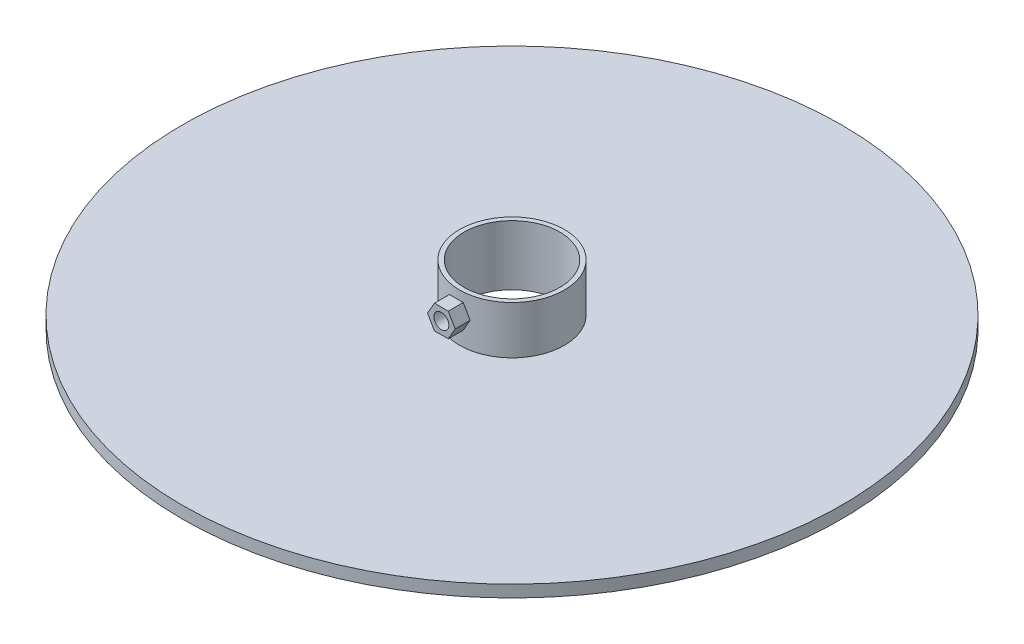
ISO-10303-21;
HEADER;
FILE_DESCRIPTION(('STEP AP214'),'2;1');
FILE_NAME('part.step','',(''),(''),'','','');
FILE_SCHEMA(('AUTOMOTIVE_DESIGN { 1 0 10303 214 1 1 1 1 }'));
ENDSEC;
DATA;
#1=APPLICATION_CONTEXT('core data for automotive mechanical design processes');
#2=APPLICATION_PROTOCOL_DEFINITION('international standard','automotive_design',2000,#1);
#3=PRODUCT_CONTEXT('',#1,'mechanical');
#4=PRODUCT('Part','Part','',(#3));
#5=PRODUCT_RELATED_PRODUCT_CATEGORY('part','',(#4));
#6=PRODUCT_DEFINITION_FORMATION('','',#4);
#7=PRODUCT_DEFINITION_CONTEXT('part definition',#1,'design');
#8=PRODUCT_DEFINITION('design','',#6,#7);
#9=PRODUCT_DEFINITION_SHAPE('','',#8);
#10=(LENGTH_UNIT() NAMED_UNIT(*) SI_UNIT(.MILLI.,.METRE.));
#11=(NAMED_UNIT(*) PLANE_ANGLE_UNIT() SI_UNIT($,.RADIAN.));
#12=(NAMED_UNIT(*) SI_UNIT($,.STERADIAN.) SOLID_ANGLE_UNIT());
#13=UNCERTAINTY_MEASURE_WITH_UNIT(LENGTH_MEASURE(1.E-05),#10,'distance_accuracy_value','');
#14=(GEOMETRIC_REPRESENTATION_CONTEXT(3) GLOBAL_UNCERTAINTY_ASSIGNED_CONTEXT((#13)) GLOBAL_UNIT_ASSIGNED_CONTEXT((#10,
#11,#12)) REPRESENTATION_CONTEXT('',''));
#15=CARTESIAN_POINT('',(0.,0.,0.));
#16=DIRECTION('',(0.,0.,1.));
#17=DIRECTION('',(1.,0.,0.));
#18=AXIS2_PLACEMENT_3D('',#15,#16,#17);
#19=CARTESIAN_POINT('',(0.,0.,22.5000000000001));
#20=DIRECTION('',(0.,0.,1.));
#21=DIRECTION('',(1.,0.,0.));
#22=AXIS2_PLACEMENT_3D('',#19,#20,#21);
#23=PLANE('',#22);
#24=DIRECTION('',(0.499999999999995,0.866025403784441,0.));
#25=VECTOR('',#24,1.);
#26=CARTESIAN_POINT('',(1.22724765148557,-620.502918688389,22.5000000000001));
#27=LINE('',#26,#25);
#28=CARTESIAN_POINT('',(1.22724765148557,-620.502918688389,22.5000000000001));
#29=VERTEX_POINT('',#28);
#30=CARTESIAN_POINT('',(3.53664872824411,-616.502918688388,22.5000000000001));
#31=VERTEX_POINT('',#30);
#32=EDGE_CURVE('E141',#29,#31,#27,.T.);
#33=ORIENTED_EDGE('',*,*,#32,.T.);
#34=DIRECTION('',(-0.500000000000005,0.866025403784436,0.));
#35=VECTOR('',#34,1.);
#36=CARTESIAN_POINT('',(3.53664872824411,-616.502918688388,22.5000000000001));
#37=LINE('',#36,#35);
#38=CARTESIAN_POINT('',(1.22724765148564,-612.502918688389,22.5000000000001));
#39=VERTEX_POINT('',#38);
#40=EDGE_CURVE('E99',#31,#39,#37,.T.);
#41=ORIENTED_EDGE('',*,*,#40,.T.);
#42=DIRECTION('',(-1.,0.,0.));
#43=VECTOR('',#42,1.);
#44=CARTESIAN_POINT('',(1.22724765148564,-612.502918688389,22.5000000000001));
#45=LINE('',#44,#43);
#46=CARTESIAN_POINT('',(-3.39155450203123,-612.502918688389,22.5000000000001));
#47=VERTEX_POINT('',#46);
#48=EDGE_CURVE('E112',#39,#47,#45,.T.);
#49=ORIENTED_EDGE('',*,*,#48,.T.);
#50=DIRECTION('',(-0.500000000000003,-0.866025403784437,0.));
#51=VECTOR('',#50,1.);
#52=CARTESIAN_POINT('',(-3.39155450203123,-612.502918688389,22.5000000000001));
#53=LINE('',#52,#51);
#54=CARTESIAN_POINT('',(-5.7009555787897,-616.502918688388,22.5000000000001));
#55=VERTEX_POINT('',#54);
#56=EDGE_CURVE('E106',#47,#55,#53,.T.);
#57=ORIENTED_EDGE('',*,*,#56,.T.);
#58=DIRECTION('',(0.499999999999997,-0.86602540378444,0.));
#59=VECTOR('',#58,1.);
#60=CARTESIAN_POINT('',(-5.7009555787897,-616.502918688388,22.5000000000001));
#61=LINE('',#60,#59);
#62=CARTESIAN_POINT('',(-3.39155450203115,-620.502918688389,22.5000000000001));
#63=VERTEX_POINT('',#62);
#64=EDGE_CURVE('E110',#55,#63,#61,.T.);
#65=ORIENTED_EDGE('',*,*,#64,.T.);
#66=DIRECTION('',(1.,0.,0.));
#67=VECTOR('',#66,1.);
#68=CARTESIAN_POINT('',(-3.39155450203115,-620.502918688389,22.5000000000001));
#69=LINE('',#68,#67);
#70=EDGE_CURVE('E62',#63,#29,#69,.T.);
#71=ORIENTED_EDGE('',*,*,#70,.T.);
#72=EDGE_LOOP('',(#33,#41,#49,#57,#65,#71));
#73=FACE_BOUND('',#72,.T.);
#74=CARTESIAN_POINT('',(-1.08215342527274,-616.502918688388,22.5000000000001));
#75=DIRECTION('',(0.,0.,1.));
#76=DIRECTION('',(1.,0.,0.));
#77=AXIS2_PLACEMENT_3D('',#74,#75,#76);
#78=CIRCLE('',#77,2.5);
#79=CARTESIAN_POINT('',(1.41784657472726,-616.502918688388,22.5000000000001));
#80=VERTEX_POINT('',#79);
#81=EDGE_CURVE('E134',#80,#80,#78,.T.);
#82=ORIENTED_EDGE('',*,*,#81,.F.);
#83=EDGE_LOOP('',(#82));
#84=FACE_BOUND('',#83,.T.);
#85=ADVANCED_FACE('F45',(#73,#84),#23,.T.);
#86=CARTESIAN_POINT('',(0.,0.,17.5000000000001));
#87=DIRECTION('',(0.,0.,1.));
#88=DIRECTION('',(1.,0.,0.));
#89=AXIS2_PLACEMENT_3D('',#86,#87,#88);
#90=PLANE('',#89);
#91=DIRECTION('',(0.499999999999995,0.866025403784441,0.));
#92=VECTOR('',#91,1.);
#93=CARTESIAN_POINT('',(1.22724765148557,-620.502918688389,17.5000000000001));
#94=LINE('',#93,#92);
#95=CARTESIAN_POINT('',(1.22724765148557,-620.502918688389,17.5000000000001));
#96=VERTEX_POINT('',#95);
#97=CARTESIAN_POINT('',(3.53664872824411,-616.502918688388,17.5000000000001));
#98=VERTEX_POINT('',#97);
#99=EDGE_CURVE('E130',#96,#98,#94,.T.);
#100=ORIENTED_EDGE('',*,*,#99,.F.);
#101=DIRECTION('',(1.,0.,0.));
#102=VECTOR('',#101,1.);
#103=CARTESIAN_POINT('',(-3.39155450203115,-620.502918688389,17.5000000000001));
#104=LINE('',#103,#102);
#105=CARTESIAN_POINT('',(-3.39155450203115,-620.502918688389,17.5000000000001));
#106=VERTEX_POINT('',#105);
#107=EDGE_CURVE('E91',#106,#96,#104,.T.);
#108=ORIENTED_EDGE('',*,*,#107,.F.);
#109=DIRECTION('',(0.499999999999997,-0.86602540378444,0.));
#110=VECTOR('',#109,1.);
#111=CARTESIAN_POINT('',(-5.7009555787897,-616.502918688388,17.5000000000001));
#112=LINE('',#111,#110);
#113=CARTESIAN_POINT('',(-5.7009555787897,-616.502918688388,17.5000000000001));
#114=VERTEX_POINT('',#113);
#115=EDGE_CURVE('E85',#114,#106,#112,.T.);
#116=ORIENTED_EDGE('',*,*,#115,.F.);
#117=DIRECTION('',(-0.500000000000003,-0.866025403784437,0.));
#118=VECTOR('',#117,1.);
#119=CARTESIAN_POINT('',(-3.39155450203123,-612.502918688389,17.5000000000001));
#120=LINE('',#119,#118);
#121=CARTESIAN_POINT('',(-3.39155450203123,-612.502918688389,17.5000000000001));
#122=VERTEX_POINT('',#121);
#123=EDGE_CURVE('E120',#122,#114,#120,.T.);
#124=ORIENTED_EDGE('',*,*,#123,.F.);
#125=DIRECTION('',(-1.,0.,0.));
#126=VECTOR('',#125,1.);
#127=CARTESIAN_POINT('',(1.22724765148564,-612.502918688389,17.5000000000001));
#128=LINE('',#127,#126);
#129=CARTESIAN_POINT('',(1.22724765148564,-612.502918688389,17.5000000000001));
#130=VERTEX_POINT('',#129);
#131=EDGE_CURVE('E136',#130,#122,#128,.T.);
#132=ORIENTED_EDGE('',*,*,#131,.F.);
#133=DIRECTION('',(-0.500000000000005,0.866025403784436,0.));
#134=VECTOR('',#133,1.);
#135=CARTESIAN_POINT('',(3.53664872824411,-616.502918688388,17.5000000000001));
#136=LINE('',#135,#134);
#137=EDGE_CURVE('E133',#98,#130,#136,.T.);
#138=ORIENTED_EDGE('',*,*,#137,.F.);
#139=EDGE_LOOP('',(#100,#108,#116,#124,#132,#138));
#140=FACE_BOUND('',#139,.T.);
#141=CARTESIAN_POINT('',(-1.08215342527274,-616.502918688388,17.5000000000001));
#142=DIRECTION('',(0.,0.,1.));
#143=DIRECTION('',(1.,0.,0.));
#144=AXIS2_PLACEMENT_3D('',#141,#142,#143);
#145=CIRCLE('',#144,2.5);
#146=CARTESIAN_POINT('',(1.41784657472726,-616.502918688388,17.5000000000001));
#147=VERTEX_POINT('',#146);
#148=EDGE_CURVE('E234',#147,#147,#145,.T.);
#149=ORIENTED_EDGE('',*,*,#148,.T.);
#150=EDGE_LOOP('',(#149));
#151=FACE_BOUND('',#150,.T.);
#152=ADVANCED_FACE('F150',(#140,#151),#90,.F.);
#153=CARTESIAN_POINT('',(1.22724765148557,-620.502918688389,22.5000000000001));
#154=DIRECTION('',(-0.866025403784441,0.499999999999996,0.));
#155=DIRECTION('',(-0.499999999999996,-0.866025403784441,0.));
#156=AXIS2_PLACEMENT_3D('',#153,#154,#155);
#157=PLANE('',#156);
#158=ORIENTED_EDGE('',*,*,#99,.T.);
#159=DIRECTION('',(0.,0.,-1.));
#160=VECTOR('',#159,1.);
#161=CARTESIAN_POINT('',(3.53664872824411,-616.502918688388,22.5000000000001));
#162=LINE('',#161,#160);
#163=EDGE_CURVE('E12',#31,#98,#162,.T.);
#164=ORIENTED_EDGE('',*,*,#163,.F.);
#165=ORIENTED_EDGE('',*,*,#32,.F.);
#166=DIRECTION('',(0.,0.,-1.));
#167=VECTOR('',#166,1.);
#168=CARTESIAN_POINT('',(1.22724765148557,-620.502918688389,22.5000000000001));
#169=LINE('',#168,#167);
#170=EDGE_CURVE('E126',#29,#96,#169,.T.);
#171=ORIENTED_EDGE('',*,*,#170,.T.);
#172=EDGE_LOOP('',(#158,#164,#165,#171));
#173=FACE_BOUND('',#172,.T.);
#174=ADVANCED_FACE('F47',(#173),#157,.F.);
#175=CARTESIAN_POINT('',(3.53664872824411,-616.502918688388,22.5000000000001));
#176=DIRECTION('',(-0.866025403784436,-0.500000000000005,0.));
#177=DIRECTION('',(0.500000000000005,-0.866025403784436,0.));
#178=AXIS2_PLACEMENT_3D('',#175,#176,#177);
#179=PLANE('',#178);
#180=ORIENTED_EDGE('',*,*,#137,.T.);
#181=DIRECTION('',(0.,0.,-1.));
#182=VECTOR('',#181,1.);
#183=CARTESIAN_POINT('',(1.22724765148564,-612.502918688389,22.5000000000001));
#184=LINE('',#183,#182);
#185=EDGE_CURVE('E54',#39,#130,#184,.T.);
#186=ORIENTED_EDGE('',*,*,#185,.F.);
#187=ORIENTED_EDGE('',*,*,#40,.F.);
#188=ORIENTED_EDGE('',*,*,#163,.T.);
#189=EDGE_LOOP('',(#180,#186,#187,#188));
#190=FACE_BOUND('',#189,.T.);
#191=ADVANCED_FACE('F175',(#190),#179,.F.);
#192=CARTESIAN_POINT('',(1.22724765148564,-612.502918688389,22.5000000000001));
#193=DIRECTION('',(0.,-1.,0.));
#194=DIRECTION('',(0.,0.,-1.));
#195=AXIS2_PLACEMENT_3D('',#192,#193,#194);
#196=PLANE('',#195);
#197=ORIENTED_EDGE('',*,*,#131,.T.);
#198=DIRECTION('',(0.,0.,-1.));
#199=VECTOR('',#198,1.);
#200=CARTESIAN_POINT('',(-3.39155450203123,-612.502918688389,22.5000000000001));
#201=LINE('',#200,#199);
#202=EDGE_CURVE('E121',#47,#122,#201,.T.);
#203=ORIENTED_EDGE('',*,*,#202,.F.);
#204=ORIENTED_EDGE('',*,*,#48,.F.);
#205=ORIENTED_EDGE('',*,*,#185,.T.);
#206=EDGE_LOOP('',(#197,#203,#204,#205));
#207=FACE_BOUND('',#206,.T.);
#208=ADVANCED_FACE('F147',(#207),#196,.F.);
#209=CARTESIAN_POINT('',(-3.39155450203123,-612.502918688389,22.5000000000001));
#210=DIRECTION('',(0.866025403784437,-0.500000000000003,0.));
#211=DIRECTION('',(0.500000000000003,0.866025403784437,0.));
#212=AXIS2_PLACEMENT_3D('',#209,#210,#211);
#213=PLANE('',#212);
#214=ORIENTED_EDGE('',*,*,#123,.T.);
#215=DIRECTION('',(0.,0.,-1.));
#216=VECTOR('',#215,1.);
#217=CARTESIAN_POINT('',(-5.7009555787897,-616.502918688388,22.5000000000001));
#218=LINE('',#217,#216);
#219=EDGE_CURVE('E117',#55,#114,#218,.T.);
#220=ORIENTED_EDGE('',*,*,#219,.F.);
#221=ORIENTED_EDGE('',*,*,#56,.F.);
#222=ORIENTED_EDGE('',*,*,#202,.T.);
#223=EDGE_LOOP('',(#214,#220,#221,#222));
#224=FACE_BOUND('',#223,.T.);
#225=ADVANCED_FACE('F118',(#224),#213,.F.);
#226=CARTESIAN_POINT('',(-5.7009555787897,-616.502918688388,22.5000000000001));
#227=DIRECTION('',(0.866025403784441,0.499999999999997,0.));
#228=DIRECTION('',(-0.499999999999997,0.866025403784441,0.));
#229=AXIS2_PLACEMENT_3D('',#226,#227,#228);
#230=PLANE('',#229);
#231=ORIENTED_EDGE('',*,*,#115,.T.);
#232=DIRECTION('',(0.,0.,-1.));
#233=VECTOR('',#232,1.);
#234=CARTESIAN_POINT('',(-3.39155450203115,-620.502918688389,22.5000000000001));
#235=LINE('',#234,#233);
#236=EDGE_CURVE('E122',#63,#106,#235,.T.);
#237=ORIENTED_EDGE('',*,*,#236,.F.);
#238=ORIENTED_EDGE('',*,*,#64,.F.);
#239=ORIENTED_EDGE('',*,*,#219,.T.);
#240=EDGE_LOOP('',(#231,#237,#238,#239));
#241=FACE_BOUND('',#240,.T.);
#242=ADVANCED_FACE('F124',(#241),#230,.F.);
#243=CARTESIAN_POINT('',(-3.39155450203115,-620.502918688389,22.5000000000001));
#244=DIRECTION('',(0.,1.,0.));
#245=DIRECTION('',(0.,0.,1.));
#246=AXIS2_PLACEMENT_3D('',#243,#244,#245);
#247=PLANE('',#246);
#248=ORIENTED_EDGE('',*,*,#107,.T.);
#249=ORIENTED_EDGE('',*,*,#170,.F.);
#250=ORIENTED_EDGE('',*,*,#70,.F.);
#251=ORIENTED_EDGE('',*,*,#236,.T.);
#252=EDGE_LOOP('',(#248,#249,#250,#251));
#253=FACE_BOUND('',#252,.T.);
#254=ADVANCED_FACE('F155',(#253),#247,.F.);
#255=CARTESIAN_POINT('',(-1.08215342527274,-616.502918688388,22.5000000000001));
#256=DIRECTION('',(0.,0.,-1.));
#257=DIRECTION('',(-1.,0.,0.));
#258=AXIS2_PLACEMENT_3D('',#255,#256,#257);
#259=CYLINDRICAL_SURFACE('',#258,2.5);
#260=ORIENTED_EDGE('',*,*,#81,.T.);
#261=EDGE_LOOP('',(#260));
#262=FACE_BOUND('',#261,.T.);
#263=ORIENTED_EDGE('',*,*,#148,.F.);
#264=EDGE_LOOP('',(#263));
#265=FACE_BOUND('',#264,.T.);
#266=ADVANCED_FACE('F157',(#262,#265),#259,.F.);
#267=CLOSED_SHELL('',(#85,#152,#174,#191,#208,#225,#242,#254,#266));
#268=MANIFOLD_SOLID_BREP('B2',#267);
#269=CARTESIAN_POINT('',(0.,-625.502918688388,-110.));
#270=DIRECTION('',(0.,-1.,0.));
#271=DIRECTION('',(0.,0.,-1.));
#272=AXIS2_PLACEMENT_3D('',#269,#270,#271);
#273=PLANE('',#272);
#274=CARTESIAN_POINT('',(0.,-625.502918688388,0.));
#275=DIRECTION('',(0.,1.,0.));
#276=DIRECTION('',(0.,0.,1.));
#277=AXIS2_PLACEMENT_3D('',#274,#275,#276);
#278=CIRCLE('',#277,17.5000000000001);
#279=CARTESIAN_POINT('',(0.,-625.502918688388,17.5000000000001));
#280=VERTEX_POINT('',#279);
#281=EDGE_CURVE('E275',#280,#280,#278,.T.);
#282=ORIENTED_EDGE('',*,*,#281,.F.);
#283=EDGE_LOOP('',(#282));
#284=FACE_BOUND('',#283,.T.);
#285=CARTESIAN_POINT('',(0.,-625.502918688388,0.));
#286=DIRECTION('',(0.,1.,0.));
#287=DIRECTION('',(0.,0.,1.));
#288=AXIS2_PLACEMENT_3D('',#285,#286,#287);
#289=CIRCLE('',#288,110.);
#290=CARTESIAN_POINT('',(0.,-625.502918688388,110.));
#291=VERTEX_POINT('',#290);
#292=EDGE_CURVE('E43',#291,#291,#289,.T.);
#293=ORIENTED_EDGE('',*,*,#292,.T.);
#294=EDGE_LOOP('',(#293));
#295=FACE_BOUND('',#294,.T.);
#296=ADVANCED_FACE('F242',(#284,#295),#273,.F.);
#297=CARTESIAN_POINT('',(0.,0.,0.));
#298=DIRECTION('',(0.,1.,0.));
#299=DIRECTION('',(0.,0.,1.));
#300=AXIS2_PLACEMENT_3D('',#297,#298,#299);
#301=CYLINDRICAL_SURFACE('',#300,110.);
#302=ORIENTED_EDGE('',*,*,#292,.F.);
#303=EDGE_LOOP('',(#302));
#304=FACE_BOUND('',#303,.T.);
#305=CARTESIAN_POINT('',(0.,-629.502918688388,0.));
#306=DIRECTION('',(0.,1.,0.));
#307=DIRECTION('',(0.,0.,1.));
#308=AXIS2_PLACEMENT_3D('',#305,#306,#307);
#309=CIRCLE('',#308,110.);
#310=CARTESIAN_POINT('',(0.,-629.502918688388,110.));
#311=VERTEX_POINT('',#310);
#312=EDGE_CURVE('E255',#311,#311,#309,.T.);
#313=ORIENTED_EDGE('',*,*,#312,.T.);
#314=EDGE_LOOP('',(#313));
#315=FACE_BOUND('',#314,.T.);
#316=ADVANCED_FACE('F301',(#304,#315),#301,.T.);
#317=CARTESIAN_POINT('',(0.,-629.502918688388,-16.0000000000001));
#318=DIRECTION('',(0.,1.,0.));
#319=DIRECTION('',(0.,0.,1.));
#320=AXIS2_PLACEMENT_3D('',#317,#318,#319);
#321=PLANE('',#320);
#322=ORIENTED_EDGE('',*,*,#312,.F.);
#323=EDGE_LOOP('',(#322));
#324=FACE_BOUND('',#323,.T.);
#325=CARTESIAN_POINT('',(0.,-629.502918688388,0.));
#326=DIRECTION('',(0.,1.,0.));
#327=DIRECTION('',(0.,0.,1.));
#328=AXIS2_PLACEMENT_3D('',#325,#326,#327);
#329=CIRCLE('',#328,16.0000000000001);
#330=CARTESIAN_POINT('',(0.,-629.502918688388,16.0000000000001));
#331=VERTEX_POINT('',#330);
#332=EDGE_CURVE('E313',#331,#331,#329,.T.);
#333=ORIENTED_EDGE('',*,*,#332,.T.);
#334=EDGE_LOOP('',(#333));
#335=FACE_BOUND('',#334,.T.);
#336=ADVANCED_FACE('F298',(#324,#335),#321,.F.);
#337=CARTESIAN_POINT('',(0.,0.,0.));
#338=DIRECTION('',(0.,1.,0.));
#339=DIRECTION('',(0.,0.,1.));
#340=AXIS2_PLACEMENT_3D('',#337,#338,#339);
#341=CYLINDRICAL_SURFACE('',#340,16.0000000000001);
#342=CARTESIAN_POINT('',(1.91784657472727,-616.502918688388,15.8846424107));
#343=CARTESIAN_POINT('',(1.91784033140445,-616.670920997696,15.8846451625477));
#344=CARTESIAN_POINT('',(1.90368898841845,-616.839006490656,15.8863714679723));
#345=CARTESIAN_POINT('',(1.84746715541341,-617.170473064672,15.8930059257932));
#346=CARTESIAN_POINT('',(1.80537321517375,-617.33385007397,15.8979167506484));
#347=CARTESIAN_POINT('',(1.6945189239203,-617.651090590947,15.9101129751613));
#348=CARTESIAN_POINT('',(1.62577478953437,-617.804959818219,15.9173969303412));
#349=CARTESIAN_POINT('',(1.46358478960825,-618.098978496201,15.9331267294519));
#350=CARTESIAN_POINT('',(1.370141811087,-618.23912954779,15.9415724375315));
#351=CARTESIAN_POINT('',(1.1606431404978,-618.502496044881,15.9581944500019));
#352=CARTESIAN_POINT('',(1.04448141984767,-618.625627272987,15.9663692724656));
#353=CARTESIAN_POINT('',(0.793061472280651,-618.850690909815,15.980828353297));
#354=CARTESIAN_POINT('',(0.657803083663386,-618.952623139017,15.9871125956548));
#355=CARTESIAN_POINT('',(0.372177693265321,-619.132242354146,15.9963071669933));
#356=CARTESIAN_POINT('',(0.221830500624476,-619.209960592556,15.9992218582701));
#357=CARTESIAN_POINT('',(-0.0897921727038332,-619.339052662929,16.0005057326595));
#358=CARTESIAN_POINT('',(-0.251066667581331,-619.390428867773,15.9988753252782));
#359=CARTESIAN_POINT('',(-0.577952064783943,-619.46493919419,15.990384303841));
#360=CARTESIAN_POINT('',(-0.743493179111852,-619.488386547129,15.9835831269115));
#361=CARTESIAN_POINT('',(-1.07586140812922,-619.507526616825,15.9646554612541));
#362=CARTESIAN_POINT('',(-1.24268848880958,-619.503220065074,15.9525291128861));
#363=CARTESIAN_POINT('',(-1.5724611170251,-619.467213180347,15.9234011923373));
#364=CARTESIAN_POINT('',(-1.73541572666665,-619.43558499218,15.9064125383698));
#365=CARTESIAN_POINT('',(-2.053480345715,-619.346125466819,15.8684874073312));
#366=CARTESIAN_POINT('',(-2.20858957790005,-619.288291539119,15.8475505400882));
#367=CARTESIAN_POINT('',(-2.50937479382029,-619.146987856513,15.8027388573578));
#368=CARTESIAN_POINT('',(-2.65485346526259,-619.063111777132,15.7788213530672));
#369=CARTESIAN_POINT('',(-2.92973678413965,-618.872397137744,15.7301036009712));
#370=CARTESIAN_POINT('',(-3.05913924380941,-618.765555457806,15.7053032336091));
#371=CARTESIAN_POINT('',(-3.30057483841539,-618.529636955526,15.6563619375186));
#372=CARTESIAN_POINT('',(-3.41226287746253,-618.40020246985,15.632240249004));
#373=CARTESIAN_POINT('',(-3.61228403514308,-618.123882558748,15.5872366954385));
#374=CARTESIAN_POINT('',(-3.70061805724355,-617.976997808718,15.5663547050706));
#375=CARTESIAN_POINT('',(-3.85059080211176,-617.67105242238,15.5299351807415));
#376=CARTESIAN_POINT('',(-3.91244139685645,-617.512100875613,15.5143554422855));
#377=CARTESIAN_POINT('',(-4.00840591684498,-617.185552656292,15.4898406916701));
#378=CARTESIAN_POINT('',(-4.04252597249027,-617.017957903212,15.4809042109204));
#379=CARTESIAN_POINT('',(-4.0812441883543,-616.684170969221,15.4707412810264));
#380=CARTESIAN_POINT('',(-4.0866807061379,-616.518082385971,15.4692959058726));
#381=CARTESIAN_POINT('',(-4.07010310183743,-616.187388688665,15.4736657820522));
#382=CARTESIAN_POINT('',(-4.04809126348577,-616.022783452341,15.4794804293441));
#383=CARTESIAN_POINT('',(-3.97786288897781,-615.702001369115,15.4976734234685));
#384=CARTESIAN_POINT('',(-3.93000385831338,-615.545740778355,15.509962168245));
#385=CARTESIAN_POINT('',(-3.80983943779794,-615.24347905229,15.5399142531006));
#386=CARTESIAN_POINT('',(-3.73753146782026,-615.097479001757,15.5575781604076));
#387=CARTESIAN_POINT('',(-3.56890867895528,-614.816679926496,15.597131502977));
#388=CARTESIAN_POINT('',(-3.47214447848455,-614.682161845111,15.6190980778355));
#389=CARTESIAN_POINT('',(-3.25805389912523,-614.431037022083,15.6651540276223));
#390=CARTESIAN_POINT('',(-3.14072411205769,-614.314433255263,15.6892437540748));
#391=CARTESIAN_POINT('',(-2.88505049224078,-614.09911849985,15.7382927578455));
#392=CARTESIAN_POINT('',(-2.74621519226301,-614.000991610859,15.7632576569607));
#393=CARTESIAN_POINT('',(-2.45374956374748,-613.829444227767,15.8114215423523));
#394=CARTESIAN_POINT('',(-2.30011884389798,-613.756024387352,15.8346204818933));
#395=CARTESIAN_POINT('',(-1.98174117294741,-613.635904474923,15.87761177742));
#396=CARTESIAN_POINT('',(-1.81696234850645,-613.58928497612,15.897393737093));
#397=CARTESIAN_POINT('',(-1.48139306419124,-613.524699223487,15.9321656626207));
#398=CARTESIAN_POINT('',(-1.31060338470854,-613.506729264002,15.9471562480123));
#399=CARTESIAN_POINT('',(-0.971413733812143,-613.500261942041,15.9713714246471));
#400=CARTESIAN_POINT('',(-0.803032170015387,-613.511196265134,15.9807028303763));
#401=CARTESIAN_POINT('',(-0.470278940836,-613.561166025938,15.9939539905507));
#402=CARTESIAN_POINT('',(-0.305906969218767,-613.600199310586,15.9978741595609));
#403=CARTESIAN_POINT('',(0.0118644760465042,-613.704575349707,16.0007749175481));
#404=CARTESIAN_POINT('',(0.165380851716123,-613.769561103126,15.9998205414155));
#405=CARTESIAN_POINT('',(0.459494142561052,-613.923982547156,15.9940778027079));
#406=CARTESIAN_POINT('',(0.600090885056885,-614.013418564498,15.9892893888968));
#407=CARTESIAN_POINT('',(0.865287925182553,-614.214827053684,15.9771409080297));
#408=CARTESIAN_POINT('',(0.989787838986782,-614.326930727593,15.9697656767854));
#409=CARTESIAN_POINT('',(1.21842571445579,-614.570249287246,15.953952667422));
#410=CARTESIAN_POINT('',(1.32255899963782,-614.701468550175,15.9455146459998));
#411=CARTESIAN_POINT('',(1.50858410745104,-614.980894278187,15.9289991586458));
#412=CARTESIAN_POINT('',(1.59022483155357,-615.129268173672,15.9209265431158));
#413=CARTESIAN_POINT('',(1.72739252819518,-615.437613070938,15.9066309344217));
#414=CARTESIAN_POINT('',(1.78294182734421,-615.597574021793,15.9004063615593));
#415=CARTESIAN_POINT('',(1.85556683514672,-615.882082804551,15.8920674999188));
#416=CARTESIAN_POINT('',(1.87888400812149,-616.005057050566,15.8893059144535));
#417=CARTESIAN_POINT('',(1.9100261136567,-616.252978427016,15.8855923562957));
#418=CARTESIAN_POINT('',(1.91785121973845,-616.377925535337,15.8846403633345));
#419=CARTESIAN_POINT('',(1.91784657472727,-616.502918688388,15.8846424107));
#420=B_SPLINE_CURVE_WITH_KNOTS('',3,(#342,#343,#344,#345,#346,#347,#348,#349,#350,#351,#352,
#353,#354,#355,#356,#357,#358,#359,#360,#361,#362,#363,#364,#365,#366,#367,#368,#369,#370,#371,
#372,#373,#374,#375,#376,#377,#378,#379,#380,#381,#382,#383,#384,#385,#386,#387,#388,#389,#390,
#391,#392,#393,#394,#395,#396,#397,#398,#399,#400,#401,#402,#403,#404,#405,#406,#407,#408,#409,
#410,#411,#412,#413,#414,#415,#416,#417,#418,#419),.UNSPECIFIED.,.T.,.F.,(4,2,2,2,2,2,2,2,2,2,2,
2,2,2,2,2,2,2,2,2,2,2,2,2,2,2,2,2,2,2,2,2,2,2,2,2,2,2,4),(0.,0.503553009632328,1.00752915041254,
1.51119910214065,2.01481020649385,2.52083030713877,3.02685469274833,3.53222323163373,
4.0375462390882,4.53714685426641,5.03673430186052,5.53500657028692,6.0333281049921,
6.53985259586544,7.04644594285298,7.56193943410732,8.07741298020355,8.58868189288071,
9.0998377483659,9.59596737069822,10.0920557172723,10.5814518616338,11.0708996687009,
11.5700939728421,12.0693710830274,12.5824576783679,13.0955578476374,13.6101926534764,
14.1247608887929,14.6292873197147,15.1337750957598,15.6315498545756,16.1293312655143,
16.6300808843264,17.1309453481056,17.6371934686359,18.1430075964191,18.5176535381949,
18.8922952836668),.UNSPECIFIED.);
#421=CARTESIAN_POINT('',(1.91784657472727,-616.502918688388,15.8846424107));
#422=VERTEX_POINT('',#421);
#423=EDGE_CURVE('E273',#422,#422,#420,.T.);
#424=ORIENTED_EDGE('',*,*,#423,.F.);
#425=EDGE_LOOP('',(#424));
#426=FACE_BOUND('',#425,.T.);
#427=ORIENTED_EDGE('',*,*,#332,.F.);
#428=EDGE_LOOP('',(#427));
#429=FACE_BOUND('',#428,.T.);
#430=CARTESIAN_POINT('',(0.,-609.502918688388,0.));
#431=DIRECTION('',(0.,1.,0.));
#432=DIRECTION('',(0.,0.,1.));
#433=AXIS2_PLACEMENT_3D('',#430,#431,#432);
#434=CIRCLE('',#433,16.0000000000001);
#435=CARTESIAN_POINT('',(0.,-609.502918688388,16.0000000000001));
#436=VERTEX_POINT('',#435);
#437=EDGE_CURVE('E316',#436,#436,#434,.T.);
#438=ORIENTED_EDGE('',*,*,#437,.T.);
#439=EDGE_LOOP('',(#438));
#440=FACE_BOUND('',#439,.T.);
#441=ADVANCED_FACE('F294',(#426,#429,#440),#341,.F.);
#442=CARTESIAN_POINT('',(0.,-609.502918688388,-17.5000000000001));
#443=DIRECTION('',(0.,-1.,0.));
#444=DIRECTION('',(0.,0.,-1.));
#445=AXIS2_PLACEMENT_3D('',#442,#443,#444);
#446=PLANE('',#445);
#447=ORIENTED_EDGE('',*,*,#437,.F.);
#448=EDGE_LOOP('',(#447));
#449=FACE_BOUND('',#448,.T.);
#450=CARTESIAN_POINT('',(0.,-609.502918688388,0.));
#451=DIRECTION('',(0.,1.,0.));
#452=DIRECTION('',(0.,0.,1.));
#453=AXIS2_PLACEMENT_3D('',#450,#451,#452);
#454=CIRCLE('',#453,17.5000000000001);
#455=CARTESIAN_POINT('',(0.,-609.502918688388,17.5000000000001));
#456=VERTEX_POINT('',#455);
#457=EDGE_CURVE('E321',#456,#456,#454,.T.);
#458=ORIENTED_EDGE('',*,*,#457,.T.);
#459=EDGE_LOOP('',(#458));
#460=FACE_BOUND('',#459,.T.);
#461=ADVANCED_FACE('F290',(#449,#460),#446,.F.);
#462=CARTESIAN_POINT('',(0.,0.,0.));
#463=DIRECTION('',(0.,1.,0.));
#464=DIRECTION('',(0.,0.,1.));
#465=AXIS2_PLACEMENT_3D('',#462,#463,#464);
#466=CYLINDRICAL_SURFACE('',#465,17.5000000000001);
#467=CARTESIAN_POINT('',(0.,-619.300943699744,17.5000000000001));
#468=CARTESIAN_POINT('',(0.0282898182038522,-619.290002617498,17.4999997776257));
#469=CARTESIAN_POINT('',(0.0564135568249031,-619.278632201121,17.4999267315175));
#470=CARTESIAN_POINT('',(0.113002988534676,-619.254748542758,17.4996410827073));
#471=CARTESIAN_POINT('',(0.141459593578775,-619.242213804581,17.4994250291486));
#472=CARTESIAN_POINT('',(0.19865951593667,-619.215948873633,17.4988534583475));
#473=CARTESIAN_POINT('',(0.227392817670525,-619.20219693778,17.4984946587116));
#474=CARTESIAN_POINT('',(0.285086644220901,-619.173446358744,17.4976373558541));
#475=CARTESIAN_POINT('',(0.314036191018346,-619.158425776607,17.497135719105));
#476=CARTESIAN_POINT('',(0.372098501549518,-619.127088066524,17.4959926637053));
#477=CARTESIAN_POINT('',(0.401199286786644,-619.110748850956,17.4953482540962));
#478=CARTESIAN_POINT('',(0.459495460589067,-619.076725903467,17.4939193278299));
#479=CARTESIAN_POINT('',(0.488677833465143,-619.059019988556,17.4931319476929));
#480=CARTESIAN_POINT('',(0.54706402272811,-619.022217752191,17.4914176627988));
#481=CARTESIAN_POINT('',(0.576253754095637,-619.003099205712,17.4904880340354));
#482=CARTESIAN_POINT('',(0.634576310574985,-618.963428787133,17.488486399237));
#483=CARTESIAN_POINT('',(0.663693937880493,-618.942854716166,17.4874117246668));
#484=CARTESIAN_POINT('',(0.721790984947237,-618.900231769352,17.4851304222009));
#485=CARTESIAN_POINT('',(0.750754102232199,-618.878160750438,17.4839214620334));
#486=CARTESIAN_POINT('',(0.795277544245187,-618.842933244216,17.4819223088581));
#487=CARTESIAN_POINT('',(0.811122866355953,-618.830131634862,17.481182178342));
#488=CARTESIAN_POINT('',(0.865765093547521,-618.785057891531,17.4785391777182));
#489=CARTESIAN_POINT('',(0.903885486189692,-618.751961773569,17.4765339423505));
#490=CARTESIAN_POINT('',(0.963361427314283,-618.697633961151,17.4732548596731));
#491=CARTESIAN_POINT('',(0.985274095460461,-618.677004515379,17.4720124392924));
#492=CARTESIAN_POINT('',(1.03079581907873,-618.632838039146,17.4693625685765));
#493=CARTESIAN_POINT('',(1.05433329332287,-618.609227205013,17.4679517594678));
#494=CARTESIAN_POINT('',(1.10285768290088,-618.558901254453,17.4649660328053));
#495=CARTESIAN_POINT('',(1.12776292873885,-618.532107557269,17.4633884992435));
#496=CARTESIAN_POINT('',(1.17873991956306,-618.475213436425,17.4600678232091));
#497=CARTESIAN_POINT('',(1.20471940054492,-618.445030415381,17.4583223952458));
#498=CARTESIAN_POINT('',(1.25752128815043,-618.381156209468,17.4546680902047));
#499=CARTESIAN_POINT('',(1.28424011748837,-618.34737947332,17.4527574753737));
#500=CARTESIAN_POINT('',(1.33815481406464,-618.276122418417,17.4487624038971));
#501=CARTESIAN_POINT('',(1.36523516185197,-618.238554714505,17.4466756884663));
#502=CARTESIAN_POINT('',(1.41442871394644,-618.166868722244,17.4427696813353));
#503=CARTESIAN_POINT('',(1.43674466558856,-618.13288939048,17.4409488491542));
#504=CARTESIAN_POINT('',(1.47900645565241,-618.065598037799,17.4374406407873));
#505=CARTESIAN_POINT('',(1.49901375080534,-618.032324739547,17.4357509455489));
#506=CARTESIAN_POINT('',(1.53681126243028,-617.96661001915,17.4324951869187));
#507=CARTESIAN_POINT('',(1.55466151694536,-617.934203215755,17.4309270486922));
#508=CARTESIAN_POINT('',(1.58829987783016,-617.870367287775,17.4279171101853));
#509=CARTESIAN_POINT('',(1.60414629946677,-617.838968996351,17.4264728962268));
#510=CARTESIAN_POINT('',(1.6339313193983,-617.777279341577,17.4237104427905));
#511=CARTESIAN_POINT('',(1.64792627294781,-617.747015295412,17.4223895575301));
#512=CARTESIAN_POINT('',(1.67416077117777,-617.687707705453,17.4198741271253));
#513=CARTESIAN_POINT('',(1.68645449340178,-617.658688243347,17.418676625928));
#514=CARTESIAN_POINT('',(1.70943564559806,-617.601969032912,17.4164084987304));
#515=CARTESIAN_POINT('',(1.72017488772944,-617.574290400072,17.4153345425831));
#516=CARTESIAN_POINT('',(1.74019179796342,-617.520338721945,17.4133130800231));
#517=CARTESIAN_POINT('',(1.74951874677325,-617.494084098225,17.4123618594323));
#518=CARTESIAN_POINT('',(1.76678366977364,-617.443250752505,17.410595958567));
#519=CARTESIAN_POINT('',(1.77477333733185,-617.4186897243,17.409776380041));
#520=CARTESIAN_POINT('',(1.79290253493077,-617.360410741542,17.4079151371064));
#521=CARTESIAN_POINT('',(1.80276910135895,-617.326606566957,17.4069009091191));
#522=CARTESIAN_POINT('',(1.82113874051974,-617.259284947817,17.4049992312194));
#523=CARTESIAN_POINT('',(1.82966327836542,-617.225773405053,17.4041098172606));
#524=CARTESIAN_POINT('',(1.84546938360783,-617.158812063864,17.4024515050217));
#525=CARTESIAN_POINT('',(1.85276261237577,-617.125365047114,17.4016814824692));
#526=CARTESIAN_POINT('',(1.86613222689713,-617.05858013368,17.4002610808051));
#527=CARTESIAN_POINT('',(1.87222023428643,-617.025244586993,17.3996095644967));
#528=CARTESIAN_POINT('',(1.88320707318525,-616.958727555268,17.3984264337244));
#529=CARTESIAN_POINT('',(1.88811746927306,-616.925548000953,17.3978936572002));
#530=CARTESIAN_POINT('',(1.89677805084351,-616.859385822638,17.3969479652935));
#531=CARTESIAN_POINT('',(1.90053972835289,-616.826404719253,17.3965338654068));
#532=CARTESIAN_POINT('',(1.9069330320512,-616.760679936261,17.3958255712328));
#533=CARTESIAN_POINT('',(1.90957606270217,-616.727937379865,17.3955301684956));
#534=CARTESIAN_POINT('',(1.91374622134657,-616.662994427803,17.3950611907905));
#535=CARTESIAN_POINT('',(1.91529325485127,-616.630795318277,17.3948854450411));
#536=CARTESIAN_POINT('',(1.91733797364649,-616.566702679486,17.394651971914));
#537=CARTESIAN_POINT('',(1.91784657321708,-616.534809516024,17.394593017222));
#538=CARTESIAN_POINT('',(1.91784657475362,-616.502362228499,17.3945929669487));
#539=CARTESIAN_POINT('',(1.9178464199301,-616.50180576932,17.3945929840211));
#540=CARTESIAN_POINT('',(1.91782830915342,-616.469262111887,17.3945950309429));
#541=CARTESIAN_POINT('',(1.91729882988551,-616.437272848405,17.3946562820127));
#542=CARTESIAN_POINT('',(1.9152059489714,-616.37298743368,17.3948950046965));
#543=CARTESIAN_POINT('',(1.91363155334426,-616.3406916581,17.3950737119172));
#544=CARTESIAN_POINT('',(1.90941750413108,-616.275826637336,17.3955473128445));
#545=CARTESIAN_POINT('',(1.90676674452699,-616.243258118615,17.3958434170878));
#546=CARTESIAN_POINT('',(1.90036952291524,-616.177885144565,17.3965518560843));
#547=CARTESIAN_POINT('',(1.89661185590285,-616.145081799297,17.3969653778058));
#548=CARTESIAN_POINT('',(1.88797138539169,-616.079278263142,17.3979086548823));
#549=CARTESIAN_POINT('',(1.8830772916844,-616.046279570853,17.3984395738489));
#550=CARTESIAN_POINT('',(1.87213567329877,-615.980126710003,17.3996177301938));
#551=CARTESIAN_POINT('',(1.86607678779031,-615.946974440722,17.4002661092969));
#552=CARTESIAN_POINT('',(1.85277853511174,-615.880557814716,17.4016789773836));
#553=CARTESIAN_POINT('',(1.84552775157674,-615.847295766969,17.4024445837969));
#554=CARTESIAN_POINT('',(1.82982011389551,-615.780705292749,17.4040928013779));
#555=CARTESIAN_POINT('',(1.82135180456637,-615.747379596645,17.4049765174899));
#556=CARTESIAN_POINT('',(1.80318479094611,-615.680708853778,17.4068576672032));
#557=CARTESIAN_POINT('',(1.79347460676401,-615.647366959985,17.4078561516691));
#558=CARTESIAN_POINT('',(1.77546437735951,-615.589299187969,17.4097059600009));
#559=CARTESIAN_POINT('',(1.76741493390318,-615.564494418698,17.410532051989));
#560=CARTESIAN_POINT('',(1.75008773085854,-615.51337927933,17.4123050223159));
#561=CARTESIAN_POINT('',(1.74076344464249,-615.487084806924,17.4132563071718));
#562=CARTESIAN_POINT('',(1.7207529906717,-615.433059477238,17.4152777992841));
#563=CARTESIAN_POINT('',(1.71001764994833,-615.405346969604,17.4163517157462));
#564=CARTESIAN_POINT('',(1.68704578638555,-615.348565930142,17.4186196566959));
#565=CARTESIAN_POINT('',(1.67475757919602,-615.319518430784,17.4198170082372));
#566=CARTESIAN_POINT('',(1.64853600228592,-615.260160497525,17.4223320320739));
#567=CARTESIAN_POINT('',(1.63454860163876,-615.229874048246,17.4236526592732));
#568=CARTESIAN_POINT('',(1.60478103648002,-615.16814508024,17.4264144869063));
#569=CARTESIAN_POINT('',(1.58894468115097,-615.136729766128,17.4278583332281));
#570=CARTESIAN_POINT('',(1.55532930408749,-615.072864983686,17.4308674274302));
#571=CARTESIAN_POINT('',(1.53749214804233,-615.040446218463,17.4324350900111));
#572=CARTESIAN_POINT('',(1.49972422215709,-614.974712389422,17.435689781734));
#573=CARTESIAN_POINT('',(1.47973361018134,-614.941431794774,17.4373788875491));
#574=CARTESIAN_POINT('',(1.43750914717849,-614.874130216637,17.4408858215826));
#575=CARTESIAN_POINT('',(1.41521404872306,-614.840147784979,17.4427059706112));
#576=CARTESIAN_POINT('',(1.36600810565868,-614.768370660512,17.4466151970372));
#577=CARTESIAN_POINT('',(1.33889066935115,-614.730717411344,17.4487058642217));
#578=CARTESIAN_POINT('',(1.28490286738271,-614.65930674092,17.4527082100612));
#579=CARTESIAN_POINT('',(1.25814881906828,-614.62546139938,17.4546221499862));
#580=CARTESIAN_POINT('',(1.20528013887469,-614.561466198807,17.4582825275798));
#581=CARTESIAN_POINT('',(1.17926977277871,-614.531230273137,17.4600307004118));
#582=CARTESIAN_POINT('',(1.12823684742552,-614.474245259692,17.4633562745856));
#583=CARTESIAN_POINT('',(1.1033071377924,-614.447413090722,17.4649359613112));
#584=CARTESIAN_POINT('',(1.05474147994772,-614.397023821106,17.4679254098036));
#585=CARTESIAN_POINT('',(1.03118769165109,-614.37338769894,17.4693377879794));
#586=CARTESIAN_POINT('',(0.985642491344062,-614.329183049479,17.4719901923177));
#587=CARTESIAN_POINT('',(0.963723062203329,-614.308540329463,17.4732335825516));
#588=CARTESIAN_POINT('',(0.904258868946158,-614.254205784472,17.4765137283541));
#589=CARTESIAN_POINT('',(0.86615780374858,-614.221115142463,17.4785192475278));
#590=CARTESIAN_POINT('',(0.811562434164077,-614.17606369769,17.48116165103));
#591=CARTESIAN_POINT('',(0.79574462658849,-614.163279236769,17.4819009897556));
#592=CARTESIAN_POINT('',(0.751231257434989,-614.128044468801,17.4839010879451));
#593=CARTESIAN_POINT('',(0.722249551621695,-614.105950303623,17.4851115271791));
#594=CARTESIAN_POINT('',(0.664114907639585,-614.063283530781,17.4873956880244));
#595=CARTESIAN_POINT('',(0.634978317683936,-614.042688726176,17.488471745132));
#596=CARTESIAN_POINT('',(0.576617624427659,-614.002979205771,17.4904759354975));
#597=CARTESIAN_POINT('',(0.547408761028843,-613.983842237036,17.4914067433445));
#598=CARTESIAN_POINT('',(0.488984298014212,-613.947005418479,17.4931232048647));
#599=CARTESIAN_POINT('',(0.459782821768544,-613.929283289432,17.4939115883077));
#600=CARTESIAN_POINT('',(0.401448615090628,-613.89523006212,17.495342331932));
#601=CARTESIAN_POINT('',(0.372328935155921,-613.878876726837,17.4959875619333));
#602=CARTESIAN_POINT('',(0.314229177706769,-613.847512805463,17.4971320703569));
#603=CARTESIAN_POINT('',(0.285261110087673,-613.832480078113,17.4976343464701));
#604=CARTESIAN_POINT('',(0.227530737668359,-613.80370711082,17.4984927392717));
#605=CARTESIAN_POINT('',(0.198779439035329,-613.789944878894,17.4988519967148));
#606=CARTESIAN_POINT('',(0.141544157166024,-613.76366112812,17.4994242942435));
#607=CARTESIAN_POINT('',(0.113070214569745,-613.751117813959,17.4996406244641));
#608=CARTESIAN_POINT('',(0.0564468667168503,-613.727218642781,17.4999266361553));
#609=CARTESIAN_POINT('',(0.0283065716281429,-613.71584123834,17.4999997768337));
#610=CARTESIAN_POINT('',(0.,-613.704893677033,17.5000000000001));
#611=B_SPLINE_CURVE_WITH_KNOTS('',3,(#467,#468,#469,#470,#471,#472,#473,#474,#475,#476,#477,
#478,#479,#480,#481,#482,#483,#484,#485,#486,#487,#488,#489,#490,#491,#492,#493,#494,#495,#496,
#497,#498,#499,#500,#501,#502,#503,#504,#505,#506,#507,#508,#509,#510,#511,#512,#513,#514,#515,
#516,#517,#518,#519,#520,#521,#522,#523,#524,#525,#526,#527,#528,#529,#530,#531,#532,#533,#534,
#535,#536,#537,#538,#539,#540,#541,#542,#543,#544,#545,#546,#547,#548,#549,#550,#551,#552,#553,
#554,#555,#556,#557,#558,#559,#560,#561,#562,#563,#564,#565,#566,#567,#568,#569,#570,#571,#572,
#573,#574,#575,#576,#577,#578,#579,#580,#581,#582,#583,#584,#585,#586,#587,#588,#589,#590,#591,
#592,#593,#594,#595,#596,#597,#598,#599,#600,#601,#602,#603,#604,#605,#606,#607,#608,#609,#610),
.UNSPECIFIED.,.F.,.F.,(4,2,2,2,2,2,2,2,2,2,2,2,2,2,2,2,2,2,2,2,2,2,2,2,2,2,2,2,2,2,2,2,2,2,2,2,
2,2,2,2,2,2,2,2,2,2,2,2,2,2,2,2,2,2,2,2,2,2,2,2,2,2,2,2,2,2,2,2,2,2,2,4),(0.,0.0909919732076077,
0.184263831446528,0.279817390538339,0.377654337994207,0.477776244600322,0.580184574730143,
0.684880695547133,0.791865885236669,0.901141340387116,0.96229068205806,1.11378059065687,
1.20413319770697,1.30422008915239,1.41404108683268,1.53359596654145,1.66288446421707,
1.80190627996547,1.92395218445825,2.04050890812275,2.15157650387295,2.25715505255788,
2.35724466808832,2.45184550405284,2.54095776236899,2.6245817047733,2.70209630642111,
2.80776087491537,2.91151099675488,3.0142154746026,3.115875383216,3.21649183095218,
3.31606596113806,3.41459895351048,3.51129302391351,3.60696546488387,3.60863484382207,
3.70459640947039,3.80158397856774,3.89959878716766,3.99864203274616,4.09871487574287,
4.1998184410269,4.30195381929453,4.40512206839889,4.50932421461845,4.58758960376248,
4.67132346272338,4.760526130933,4.85519787249579,4.95533889165682,5.06094934426522,
5.17202934641731,5.28857898107186,5.4105983031825,5.54989331523294,5.67940880433802,
5.7991444664052,5.90910003347719,6.00927527774582,6.09967001773794,6.25110553449124,
6.31215833299395,6.42152026354088,6.52858784707242,6.63336228179162,6.73584484769867,
6.83603691399835,6.93393994736241,7.02955552116657,7.12288532584326,7.21393118051377),.UNSPECIFIED.);
#612=CARTESIAN_POINT('',(0.,-619.300943699744,17.5000000000001));
#613=VERTEX_POINT('',#612);
#614=CARTESIAN_POINT('',(0.,-613.704893677033,17.5000000000001));
#615=VERTEX_POINT('',#614);
#616=EDGE_CURVE('E262',#613,#615,#611,.T.);
#617=ORIENTED_EDGE('',*,*,#616,.F.);
#618=CARTESIAN_POINT('',(1.91784657472727,-616.502918688388,17.3945929678107));
#619=CARTESIAN_POINT('',(1.91784006203756,-616.334832709409,17.3945955932105));
#620=CARTESIAN_POINT('',(1.9036745123938,-616.166657153094,17.3961735440873));
#621=CARTESIAN_POINT('',(1.84739041971125,-615.835000587676,17.4022389458739));
#622=CARTESIAN_POINT('',(1.80524673413488,-615.671523939229,17.4067290136725));
#623=CARTESIAN_POINT('',(1.69425171042875,-615.354083754271,17.4178816899446));
#624=CARTESIAN_POINT('',(1.62541604220064,-615.200114697558,17.4245430233812));
#625=CARTESIAN_POINT('',(1.46300498338749,-614.905920986269,17.4389286279344));
#626=CARTESIAN_POINT('',(1.36943300765743,-614.765694438193,17.4466527522618));
#627=CARTESIAN_POINT('',(1.15973098244951,-614.502318450186,17.4618466344676));
#628=CARTESIAN_POINT('',(1.04351191587343,-614.379239797624,17.4693152472053));
#629=CARTESIAN_POINT('',(0.791998133536007,-614.154297861243,17.4825216555867));
#630=CARTESIAN_POINT('',(0.656703164600647,-614.052434859041,17.4882594282558));
#631=CARTESIAN_POINT('',(0.371004507535733,-613.87294551806,17.4966489899886));
#632=CARTESIAN_POINT('',(0.220617518063492,-613.795292774136,17.499304149806));
#633=CARTESIAN_POINT('',(-0.0910704533353595,-613.666337335948,17.5004561003763));
#634=CARTESIAN_POINT('',(-0.252370609369679,-613.615032650221,17.498953205462));
#635=CARTESIAN_POINT('',(-0.5796172117192,-613.54059716325,17.4911568100634));
#636=CARTESIAN_POINT('',(-0.745504980561007,-613.517203409574,17.4849089437034));
#637=CARTESIAN_POINT('',(-1.07860044423445,-613.498286482292,17.467525011597));
#638=CARTESIAN_POINT('',(-1.24580810888444,-613.502762673224,17.4563890573088));
#639=CARTESIAN_POINT('',(-1.57643908098232,-613.539257584803,17.4296385308322));
#640=CARTESIAN_POINT('',(-1.73986984846446,-613.571216198398,17.4140337820268));
#641=CARTESIAN_POINT('',(-2.05886232359767,-613.661523754152,17.3792074278839));
#642=CARTESIAN_POINT('',(-2.21442335807897,-613.719874949679,17.3599855137988));
#643=CARTESIAN_POINT('',(-2.51563884112504,-613.862227112725,17.3189204163196));
#644=CARTESIAN_POINT('',(-2.66112599613628,-613.946572554397,17.2970445792259));
#645=CARTESIAN_POINT('',(-2.93593826935354,-614.138271372725,17.2525266427236));
#646=CARTESIAN_POINT('',(-3.06526157005706,-614.245627333061,17.2298844575081));
#647=CARTESIAN_POINT('',(-3.30604244800029,-614.482222122003,17.185322777691));
#648=CARTESIAN_POINT('',(-3.41721255996728,-614.611756741037,17.1634186006476));
#649=CARTESIAN_POINT('',(-3.61619228832536,-614.888102214721,17.1226021112271));
#650=CARTESIAN_POINT('',(-3.70400272208564,-615.034912464627,17.1036896941759));
#651=CARTESIAN_POINT('',(-3.8530546919199,-615.340669624295,17.0707288540821));
#652=CARTESIAN_POINT('',(-3.91448036383887,-615.499523006201,17.0566468639955));
#653=CARTESIAN_POINT('',(-4.00965080241817,-615.825712140251,17.0345271453007));
#654=CARTESIAN_POINT('',(-4.04340055079522,-615.993046360068,17.026488328932));
#655=CARTESIAN_POINT('',(-4.08159243141584,-616.327052030987,17.0173729263314));
#656=CARTESIAN_POINT('',(-4.08673158828832,-616.493639482829,17.0161307697742));
#657=CARTESIAN_POINT('',(-4.0694013948934,-616.825278709077,17.0202834781643));
#658=CARTESIAN_POINT('',(-4.04693397921089,-616.990330590275,17.0256778780419));
#659=CARTESIAN_POINT('',(-3.97554563726906,-617.312354899158,17.0424864613718));
#660=CARTESIAN_POINT('',(-3.92691890555788,-617.469396309951,17.0538336634629));
#661=CARTESIAN_POINT('',(-3.8049217274316,-617.773083099557,17.0814653751654));
#662=CARTESIAN_POINT('',(-3.73154903981564,-617.919727535278,17.0977503319678));
#663=CARTESIAN_POINT('',(-3.56076775123179,-618.201157435743,17.1341370974519));
#664=CARTESIAN_POINT('',(-3.46297801513465,-618.335703804058,17.1542981359137));
#665=CARTESIAN_POINT('',(-3.2467333038515,-618.586675187532,17.1965355369153));
#666=CARTESIAN_POINT('',(-3.12827545205607,-618.703097675917,17.2186121658536));
#667=CARTESIAN_POINT('',(-2.87088969673794,-618.917268493753,17.2634124957465));
#668=CARTESIAN_POINT('',(-2.7315548104854,-619.014527590717,17.2861394292291));
#669=CARTESIAN_POINT('',(-2.4382846131212,-619.184264046627,17.3299371875486));
#670=CARTESIAN_POINT('',(-2.28434902460622,-619.256740934609,17.3510079809061));
#671=CARTESIAN_POINT('',(-1.96573130902476,-619.374889638906,17.3899882219844));
#672=CARTESIAN_POINT('',(-1.80102643506038,-619.420502538411,17.4078906613634));
#673=CARTESIAN_POINT('',(-1.46586430197121,-619.483157214045,17.4393104445924));
#674=CARTESIAN_POINT('',(-1.29540766050247,-619.50020204807,17.4528282576434));
#675=CARTESIAN_POINT('',(-0.95656252844179,-619.504995539478,17.4746485756245));
#676=CARTESIAN_POINT('',(-0.788186010540901,-619.493220431314,17.4830330358894));
#677=CARTESIAN_POINT('',(-0.455622049866464,-619.441586668603,17.4948591463129));
#678=CARTESIAN_POINT('',(-0.291434344931107,-619.401729776077,17.4983011065527));
#679=CARTESIAN_POINT('',(0.0262082560946201,-619.295636001972,17.5006939869575));
#680=CARTESIAN_POINT('',(0.179760867393896,-619.229692292525,17.4996935955312));
#681=CARTESIAN_POINT('',(0.47375862339052,-619.073300425576,17.4942046195562));
#682=CARTESIAN_POINT('',(0.614203680559293,-618.982852104455,17.4897160117159));
#683=CARTESIAN_POINT('',(0.878793095182974,-618.779468316764,17.4784260810038));
#684=CARTESIAN_POINT('',(1.00284915798482,-618.666418686258,17.4716128874069));
#685=CARTESIAN_POINT('',(1.23041455998817,-618.421253216284,17.4570649172899));
#686=CARTESIAN_POINT('',(1.33391913626305,-618.289132969312,17.4493299278014));
#687=CARTESIAN_POINT('',(1.51832822668189,-618.008236909692,17.4342577051933));
#688=CARTESIAN_POINT('',(1.59902126123809,-617.859322076638,17.4269246717245));
#689=CARTESIAN_POINT('',(1.73420601662483,-617.550079024495,17.4139937409787));
#690=CARTESIAN_POINT('',(1.78872165442574,-617.389761377962,17.408394261509));
#691=CARTESIAN_POINT('',(1.8587332772448,-617.107923179398,17.4010330037476));
#692=CARTESIAN_POINT('',(1.88086641707884,-616.988023711025,17.3986368554401));
#693=CARTESIAN_POINT('',(1.91042536546076,-616.746404718124,17.3954158928538));
#694=CARTESIAN_POINT('',(1.91785129271484,-616.624685208294,17.3945910658924));
#695=CARTESIAN_POINT('',(1.91784657472727,-616.502918688388,17.3945929678107));
#696=B_SPLINE_CURVE_WITH_KNOTS('',3,(#618,#619,#620,#621,#622,#623,#624,#625,#626,#627,#628,
#629,#630,#631,#632,#633,#634,#635,#636,#637,#638,#639,#640,#641,#642,#643,#644,#645,#646,#647,
#648,#649,#650,#651,#652,#653,#654,#655,#656,#657,#658,#659,#660,#661,#662,#663,#664,#665,#666,
#667,#668,#669,#670,#671,#672,#673,#674,#675,#676,#677,#678,#679,#680,#681,#682,#683,#684,#685,
#686,#687,#688,#689,#690,#691,#692,#693,#694,#695),.UNSPECIFIED.,.T.,.F.,(4,2,2,2,2,2,2,2,2,2,2,
2,2,2,2,2,2,2,2,2,2,2,2,2,2,2,2,2,2,2,2,2,2,2,2,2,2,2,4),(0.,0.503815426090287,1.00808421963343,
1.51205742223284,2.01596108747349,2.52188688224117,3.02781939225189,3.53319815616736,
4.03853871645438,4.53907982750533,5.03960952580663,5.5390472873364,6.03852769832937,
6.54493459810953,7.05139838836577,7.56523452665371,8.0790526831404,8.58922428917135,
9.09930404321247,9.59690074455088,10.09446257781,10.5865422321967,11.078666465408,
11.5790136941736,12.0794306174089,12.5913183669311,13.1032158439176,13.6162318491229,
14.1291929381148,14.6337350117615,15.1382454301942,15.6372401177,16.1362381371142,
16.6378234547544,17.1395248823763,17.6457353706753,18.1514824757374,18.5164644132236,
18.8814434048222),.UNSPECIFIED.);
#697=EDGE_CURVE('E269',#615,#613,#696,.T.);
#698=ORIENTED_EDGE('',*,*,#697,.F.);
#699=EDGE_LOOP('',(#617,#698));
#700=FACE_BOUND('',#699,.T.);
#701=ORIENTED_EDGE('',*,*,#457,.F.);
#702=EDGE_LOOP('',(#701));
#703=FACE_BOUND('',#702,.T.);
#704=ORIENTED_EDGE('',*,*,#281,.T.);
#705=EDGE_LOOP('',(#704));
#706=FACE_BOUND('',#705,.T.);
#707=ADVANCED_FACE('F271',(#700,#703,#706),#466,.T.);
#708=CARTESIAN_POINT('',(-1.08215342527274,-616.502918688388,-110.001));
#709=DIRECTION('',(0.,0.,1.));
#710=DIRECTION('',(1.,0.,0.));
#711=AXIS2_PLACEMENT_3D('',#708,#709,#710);
#712=CYLINDRICAL_SURFACE('',#711,3.);
#713=ORIENTED_EDGE('',*,*,#697,.T.);
#714=ORIENTED_EDGE('',*,*,#616,.T.);
#715=EDGE_LOOP('',(#713,#714));
#716=FACE_BOUND('',#715,.T.);
#717=ORIENTED_EDGE('',*,*,#423,.T.);
#718=EDGE_LOOP('',(#717));
#719=FACE_BOUND('',#718,.T.);
#720=ADVANCED_FACE('F267',(#716,#719),#712,.F.);
#721=CLOSED_SHELL('',(#296,#316,#336,#441,#461,#707,#720));
#722=MANIFOLD_SOLID_BREP('B6',#721);
#723=ADVANCED_BREP_SHAPE_REPRESENTATION('',(#18,#268,#722),#14);
#724=SHAPE_DEFINITION_REPRESENTATION(#9,#723);
ENDSEC;
END-ISO-10303-21;
